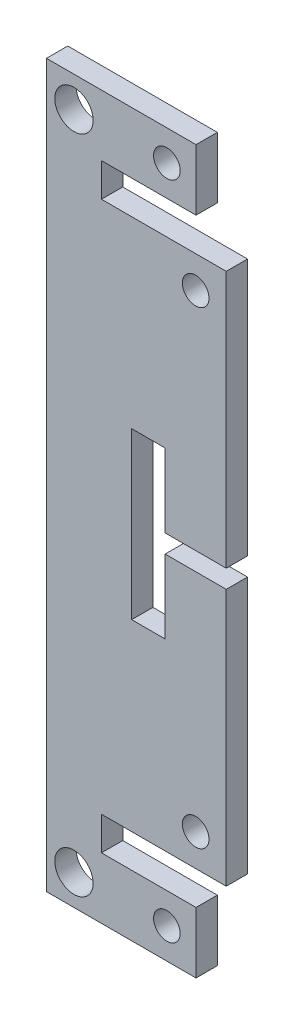
ISO-10303-21;
HEADER;
FILE_DESCRIPTION(('STEP AP214'),'2;1');
FILE_NAME('part.step','',(''),(''),'','','');
FILE_SCHEMA(('AUTOMOTIVE_DESIGN { 1 0 10303 214 1 1 1 1 }'));
ENDSEC;
DATA;
#1=APPLICATION_CONTEXT('core data for automotive mechanical design processes');
#2=APPLICATION_PROTOCOL_DEFINITION('international standard','automotive_design',2000,#1);
#3=PRODUCT_CONTEXT('',#1,'mechanical');
#4=PRODUCT('Part','Part','',(#3));
#5=PRODUCT_RELATED_PRODUCT_CATEGORY('part','',(#4));
#6=PRODUCT_DEFINITION_FORMATION('','',#4);
#7=PRODUCT_DEFINITION_CONTEXT('part definition',#1,'design');
#8=PRODUCT_DEFINITION('design','',#6,#7);
#9=PRODUCT_DEFINITION_SHAPE('','',#8);
#10=(LENGTH_UNIT() NAMED_UNIT(*) SI_UNIT(.MILLI.,.METRE.));
#11=(NAMED_UNIT(*) PLANE_ANGLE_UNIT() SI_UNIT($,.RADIAN.));
#12=(NAMED_UNIT(*) SI_UNIT($,.STERADIAN.) SOLID_ANGLE_UNIT());
#13=UNCERTAINTY_MEASURE_WITH_UNIT(LENGTH_MEASURE(1.E-05),#10,'distance_accuracy_value','');
#14=(GEOMETRIC_REPRESENTATION_CONTEXT(3) GLOBAL_UNCERTAINTY_ASSIGNED_CONTEXT((#13)) GLOBAL_UNIT_ASSIGNED_CONTEXT((#10,
#11,#12)) REPRESENTATION_CONTEXT('',''));
#15=CARTESIAN_POINT('',(0.,0.,0.));
#16=DIRECTION('',(0.,0.,1.));
#17=DIRECTION('',(1.,0.,0.));
#18=AXIS2_PLACEMENT_3D('',#15,#16,#17);
#19=CARTESIAN_POINT('',(0.,0.,-2.));
#20=DIRECTION('',(-1.,0.,0.));
#21=DIRECTION('',(0.,0.,1.));
#22=AXIS2_PLACEMENT_3D('',#19,#20,#21);
#23=PLANE('',#22);
#24=DIRECTION('',(0.,-1.,0.));
#25=VECTOR('',#24,1.);
#26=CARTESIAN_POINT('',(0.,0.,0.));
#27=LINE('',#26,#25);
#28=CARTESIAN_POINT('',(0.,33.8781926535898,0.));
#29=VERTEX_POINT('',#28);
#30=CARTESIAN_POINT('',(0.,-33.8781926535898,0.));
#31=VERTEX_POINT('',#30);
#32=EDGE_CURVE('E530',#29,#31,#27,.T.);
#33=ORIENTED_EDGE('',*,*,#32,.F.);
#34=DIRECTION('',(0.,0.,-1.));
#35=VECTOR('',#34,1.);
#36=CARTESIAN_POINT('',(0.,33.8781926535898,0.));
#37=LINE('',#36,#35);
#38=CARTESIAN_POINT('',(0.,33.8781926535898,-1.99999999999996));
#39=VERTEX_POINT('',#38);
#40=EDGE_CURVE('E361',#29,#39,#37,.T.);
#41=ORIENTED_EDGE('',*,*,#40,.T.);
#42=DIRECTION('',(0.,-1.,0.));
#43=VECTOR('',#42,1.);
#44=CARTESIAN_POINT('',(0.,0.,-2.));
#45=LINE('',#44,#43);
#46=CARTESIAN_POINT('',(0.,-33.8781926535898,-1.99999999999996));
#47=VERTEX_POINT('',#46);
#48=EDGE_CURVE('E301',#39,#47,#45,.T.);
#49=ORIENTED_EDGE('',*,*,#48,.T.);
#50=DIRECTION('',(0.,0.,-1.));
#51=VECTOR('',#50,1.);
#52=CARTESIAN_POINT('',(0.,-33.8781926535898,0.));
#53=LINE('',#52,#51);
#54=EDGE_CURVE('E422',#31,#47,#53,.T.);
#55=ORIENTED_EDGE('',*,*,#54,.F.);
#56=EDGE_LOOP('',(#33,#41,#49,#55));
#57=FACE_BOUND('',#56,.T.);
#58=ADVANCED_FACE('F152',(#57),#23,.T.);
#59=CARTESIAN_POINT('',(0.,0.,-2.));
#60=DIRECTION('',(0.,0.,-1.));
#61=DIRECTION('',(-1.,0.,0.));
#62=AXIS2_PLACEMENT_3D('',#59,#60,#61);
#63=PLANE('',#62);
#64=ORIENTED_EDGE('',*,*,#48,.F.);
#65=DIRECTION('',(1.,0.,0.));
#66=VECTOR('',#65,1.);
#67=CARTESIAN_POINT('',(7.30499265358981,33.8781926535898,-1.99999999999997));
#68=LINE('',#67,#66);
#69=CARTESIAN_POINT('',(14.0415926535898,33.8781926535898,-1.99999999999992));
#70=VERTEX_POINT('',#69);
#71=EDGE_CURVE('E401',#70,#39,#68,.F.);
#72=ORIENTED_EDGE('',*,*,#71,.F.);
#73=DIRECTION('',(0.,-1.,0.));
#74=VECTOR('',#73,1.);
#75=CARTESIAN_POINT('',(14.0415926535898,33.8781926535898,-1.99999999999992));
#76=LINE('',#75,#74);
#77=CARTESIAN_POINT('',(14.0415926535898,28.1415926535898,-1.99999999999996));
#78=VERTEX_POINT('',#77);
#79=EDGE_CURVE('E398',#78,#70,#76,.F.);
#80=ORIENTED_EDGE('',*,*,#79,.F.);
#81=DIRECTION('',(-1.,0.,0.));
#82=VECTOR('',#81,1.);
#83=CARTESIAN_POINT('',(14.0415926535898,28.1415926535898,-1.99999999999996));
#84=LINE('',#83,#82);
#85=CARTESIAN_POINT('',(5.1634,28.1415926535898,-2.));
#86=VERTEX_POINT('',#85);
#87=EDGE_CURVE('E373',#86,#78,#84,.F.);
#88=ORIENTED_EDGE('',*,*,#87,.F.);
#89=DIRECTION('',(0.,1.,0.));
#90=VECTOR('',#89,1.);
#91=CARTESIAN_POINT('',(5.1634,26.5707963267949,-2.));
#92=LINE('',#91,#90);
#93=CARTESIAN_POINT('',(5.1634,25.,-2.));
#94=VERTEX_POINT('',#93);
#95=EDGE_CURVE('E410',#86,#94,#92,.F.);
#96=ORIENTED_EDGE('',*,*,#95,.T.);
#97=DIRECTION('',(-1.,0.,0.));
#98=VECTOR('',#97,1.);
#99=CARTESIAN_POINT('',(0.,25.,-2.));
#100=LINE('',#99,#98);
#101=CARTESIAN_POINT('',(16.8781926535898,25.,-1.99999999999996));
#102=VERTEX_POINT('',#101);
#103=EDGE_CURVE('E539',#102,#94,#100,.T.);
#104=ORIENTED_EDGE('',*,*,#103,.F.);
#105=DIRECTION('',(0.,-1.,0.));
#106=VECTOR('',#105,1.);
#107=CARTESIAN_POINT('',(16.8781926535898,5.6217073464102,-1.99999999999997));
#108=LINE('',#107,#106);
#109=CARTESIAN_POINT('',(16.8781926535898,0.858407346410201,-1.99999999999994));
#110=VERTEX_POINT('',#109);
#111=EDGE_CURVE('E316',#110,#102,#108,.F.);
#112=ORIENTED_EDGE('',*,*,#111,.F.);
#113=DIRECTION('',(-1.,0.,0.));
#114=VECTOR('',#113,1.);
#115=CARTESIAN_POINT('',(16.8781926535898,0.858407346410201,-1.99999999999994));
#116=LINE('',#115,#114);
#117=CARTESIAN_POINT('',(11.1415926535898,0.858407346410201,-1.99999999999998));
#118=VERTEX_POINT('',#117);
#119=EDGE_CURVE('E349',#118,#110,#116,.F.);
#120=ORIENTED_EDGE('',*,*,#119,.F.);
#121=DIRECTION('',(0.,1.,0.));
#122=VECTOR('',#121,1.);
#123=CARTESIAN_POINT('',(11.1415926535898,0.858407346410201,-1.99999999999998));
#124=LINE('',#123,#122);
#125=CARTESIAN_POINT('',(11.1415926535898,7.7633,-2.));
#126=VERTEX_POINT('',#125);
#127=EDGE_CURVE('E312',#126,#118,#124,.F.);
#128=ORIENTED_EDGE('',*,*,#127,.F.);
#129=DIRECTION('',(-1.,0.,0.));
#130=VECTOR('',#129,1.);
#131=CARTESIAN_POINT('',(9.5707963267949,7.7633,-2.));
#132=LINE('',#131,#130);
#133=CARTESIAN_POINT('',(8.,7.7633,-2.));
#134=VERTEX_POINT('',#133);
#135=EDGE_CURVE('E325',#126,#134,#132,.T.);
#136=ORIENTED_EDGE('',*,*,#135,.T.);
#137=DIRECTION('',(0.,1.,0.));
#138=VECTOR('',#137,1.);
#139=CARTESIAN_POINT('',(8.,0.,-2.));
#140=LINE('',#139,#138);
#141=CARTESIAN_POINT('',(8.,-7.7633,-2.));
#142=VERTEX_POINT('',#141);
#143=EDGE_CURVE('E529',#142,#134,#140,.T.);
#144=ORIENTED_EDGE('',*,*,#143,.F.);
#145=DIRECTION('',(-1.,0.,0.));
#146=VECTOR('',#145,1.);
#147=CARTESIAN_POINT('',(9.5707963267949,-7.7633,-2.));
#148=LINE('',#147,#146);
#149=CARTESIAN_POINT('',(11.1415926535898,-7.7633,-2.));
#150=VERTEX_POINT('',#149);
#151=EDGE_CURVE('E521',#142,#150,#148,.F.);
#152=ORIENTED_EDGE('',*,*,#151,.T.);
#153=DIRECTION('',(0.,1.,0.));
#154=VECTOR('',#153,1.);
#155=CARTESIAN_POINT('',(11.1415926535898,-6.1925036732051,-2.));
#156=LINE('',#155,#154);
#157=CARTESIAN_POINT('',(11.1415926535898,-0.858407346410197,-1.99999999999997));
#158=VERTEX_POINT('',#157);
#159=EDGE_CURVE('E495',#150,#158,#156,.T.);
#160=ORIENTED_EDGE('',*,*,#159,.T.);
#161=DIRECTION('',(-1.,0.,0.));
#162=VECTOR('',#161,1.);
#163=CARTESIAN_POINT('',(16.8781926535898,-0.858407346410197,-1.99999999999993));
#164=LINE('',#163,#162);
#165=CARTESIAN_POINT('',(16.8781926535898,-0.858407346410197,-1.99999999999993));
#166=VERTEX_POINT('',#165);
#167=EDGE_CURVE('E484',#158,#166,#164,.F.);
#168=ORIENTED_EDGE('',*,*,#167,.T.);
#169=DIRECTION('',(0.,1.,0.));
#170=VECTOR('',#169,1.);
#171=CARTESIAN_POINT('',(16.8781926535898,-25.,-1.99999999999996));
#172=LINE('',#171,#170);
#173=CARTESIAN_POINT('',(16.8781926535898,-25.,-1.99999999999996));
#174=VERTEX_POINT('',#173);
#175=EDGE_CURVE('E501',#166,#174,#172,.F.);
#176=ORIENTED_EDGE('',*,*,#175,.T.);
#177=DIRECTION('',(-1.,0.,0.));
#178=VECTOR('',#177,1.);
#179=CARTESIAN_POINT('',(0.,-25.,-2.));
#180=LINE('',#179,#178);
#181=CARTESIAN_POINT('',(5.1634,-25.,-2.));
#182=VERTEX_POINT('',#181);
#183=EDGE_CURVE('E533',#174,#182,#180,.T.);
#184=ORIENTED_EDGE('',*,*,#183,.T.);
#185=DIRECTION('',(0.,1.,0.));
#186=VECTOR('',#185,1.);
#187=CARTESIAN_POINT('',(5.1634,-26.5707963267949,-2.));
#188=LINE('',#187,#186);
#189=CARTESIAN_POINT('',(5.1634,-28.1415926535898,-2.));
#190=VERTEX_POINT('',#189);
#191=EDGE_CURVE('E471',#182,#190,#188,.F.);
#192=ORIENTED_EDGE('',*,*,#191,.T.);
#193=DIRECTION('',(-1.,0.,0.));
#194=VECTOR('',#193,1.);
#195=CARTESIAN_POINT('',(14.0415926535898,-28.1415926535898,-1.99999999999996));
#196=LINE('',#195,#194);
#197=CARTESIAN_POINT('',(14.0415926535898,-28.1415926535898,-1.99999999999996));
#198=VERTEX_POINT('',#197);
#199=EDGE_CURVE('E449',#190,#198,#196,.F.);
#200=ORIENTED_EDGE('',*,*,#199,.T.);
#201=DIRECTION('',(0.,1.,0.));
#202=VECTOR('',#201,1.);
#203=CARTESIAN_POINT('',(14.0415926535898,-33.8781926535898,-1.99999999999992));
#204=LINE('',#203,#202);
#205=CARTESIAN_POINT('',(14.0415926535898,-33.8781926535898,-1.99999999999992));
#206=VERTEX_POINT('',#205);
#207=EDGE_CURVE('E446',#198,#206,#204,.F.);
#208=ORIENTED_EDGE('',*,*,#207,.T.);
#209=DIRECTION('',(1.,0.,0.));
#210=VECTOR('',#209,1.);
#211=CARTESIAN_POINT('',(7.30499265358981,-33.8781926535898,-1.99999999999997));
#212=LINE('',#211,#210);
#213=EDGE_CURVE('E442',#206,#47,#212,.F.);
#214=ORIENTED_EDGE('',*,*,#213,.T.);
#215=EDGE_LOOP('',(#64,#72,#80,#88,#96,#104,#112,#120,#128,#136,#144,#152,#160,#168,#176,#184,
#192,#200,#208,#214));
#216=FACE_BOUND('',#215,.T.);
#217=CARTESIAN_POINT('',(14.0098926535898,-22.,-1.99999999999998));
#218=DIRECTION('',(0.,0.,1.));
#219=DIRECTION('',(-1.,0.,0.));
#220=AXIS2_PLACEMENT_3D('',#217,#218,#219);
#221=CIRCLE('',#220,1.25);
#222=CARTESIAN_POINT('',(12.7598926535898,-22.,-1.99999999999999));
#223=VERTEX_POINT('',#222);
#224=EDGE_CURVE('E506',#223,#223,#221,.T.);
#225=ORIENTED_EDGE('',*,*,#224,.T.);
#226=EDGE_LOOP('',(#225));
#227=FACE_BOUND('',#226,.T.);
#228=CARTESIAN_POINT('',(2.5817,-31.0098926535898,-1.99999999999998));
#229=DIRECTION('',(0.,0.,1.));
#230=DIRECTION('',(0.,-1.,0.));
#231=AXIS2_PLACEMENT_3D('',#228,#229,#230);
#232=CIRCLE('',#231,1.8);
#233=CARTESIAN_POINT('',(2.5817,-32.8098926535898,-1.99999999999997));
#234=VERTEX_POINT('',#233);
#235=EDGE_CURVE('E430',#234,#234,#232,.F.);
#236=ORIENTED_EDGE('',*,*,#235,.F.);
#237=EDGE_LOOP('',(#236));
#238=FACE_BOUND('',#237,.T.);
#239=CARTESIAN_POINT('',(11.3049926535898,-31.0098926535898,-1.99999999999996));
#240=DIRECTION('',(0.,0.,1.));
#241=DIRECTION('',(1.,0.,0.));
#242=AXIS2_PLACEMENT_3D('',#239,#240,#241);
#243=CIRCLE('',#242,1.25);
#244=CARTESIAN_POINT('',(12.5549926535898,-31.0098926535898,-1.99999999999995));
#245=VERTEX_POINT('',#244);
#246=EDGE_CURVE('E414',#245,#245,#243,.F.);
#247=ORIENTED_EDGE('',*,*,#246,.F.);
#248=EDGE_LOOP('',(#247));
#249=FACE_BOUND('',#248,.T.);
#250=CARTESIAN_POINT('',(11.3049926535898,31.0098926535898,-1.99999999999996));
#251=DIRECTION('',(0.,0.,-1.));
#252=DIRECTION('',(1.,0.,0.));
#253=AXIS2_PLACEMENT_3D('',#250,#251,#252);
#254=CIRCLE('',#253,1.25);
#255=CARTESIAN_POINT('',(12.5549926535898,31.0098926535898,-1.99999999999995));
#256=VERTEX_POINT('',#255);
#257=EDGE_CURVE('E376',#256,#256,#254,.F.);
#258=ORIENTED_EDGE('',*,*,#257,.T.);
#259=EDGE_LOOP('',(#258));
#260=FACE_BOUND('',#259,.T.);
#261=CARTESIAN_POINT('',(2.5817,31.0098926535898,-1.99999999999998));
#262=DIRECTION('',(0.,0.,-1.));
#263=DIRECTION('',(0.,1.,0.));
#264=AXIS2_PLACEMENT_3D('',#261,#262,#263);
#265=CIRCLE('',#264,1.8);
#266=CARTESIAN_POINT('',(2.5817,32.8098926535898,-1.99999999999997));
#267=VERTEX_POINT('',#266);
#268=EDGE_CURVE('E365',#267,#267,#265,.F.);
#269=ORIENTED_EDGE('',*,*,#268,.T.);
#270=EDGE_LOOP('',(#269));
#271=FACE_BOUND('',#270,.T.);
#272=CARTESIAN_POINT('',(14.0098926535898,22.,-1.99999999999998));
#273=DIRECTION('',(0.,0.,-1.));
#274=DIRECTION('',(-1.,0.,0.));
#275=AXIS2_PLACEMENT_3D('',#272,#273,#274);
#276=CIRCLE('',#275,1.25);
#277=CARTESIAN_POINT('',(12.7598926535898,22.,-1.99999999999999));
#278=VERTEX_POINT('',#277);
#279=EDGE_CURVE('E328',#278,#278,#276,.T.);
#280=ORIENTED_EDGE('',*,*,#279,.F.);
#281=EDGE_LOOP('',(#280));
#282=FACE_BOUND('',#281,.T.);
#283=ADVANCED_FACE('F565',(#216,#227,#238,#249,#260,#271,#282),#63,.T.);
#284=CARTESIAN_POINT('',(0.,0.,0.));
#285=DIRECTION('',(0.,0.,-1.));
#286=DIRECTION('',(-1.,0.,0.));
#287=AXIS2_PLACEMENT_3D('',#284,#285,#286);
#288=PLANE('',#287);
#289=ORIENTED_EDGE('',*,*,#32,.T.);
#290=DIRECTION('',(-1.,0.,0.));
#291=VECTOR('',#290,1.);
#292=CARTESIAN_POINT('',(33.3049926535898,-33.8781926535898,2.15105711021124E-13));
#293=LINE('',#292,#291);
#294=CARTESIAN_POINT('',(14.0415926535898,-33.8781926535898,0.));
#295=VERTEX_POINT('',#294);
#296=EDGE_CURVE('E460',#295,#31,#293,.T.);
#297=ORIENTED_EDGE('',*,*,#296,.F.);
#298=DIRECTION('',(0.,-1.,0.));
#299=VECTOR('',#298,1.);
#300=CARTESIAN_POINT('',(14.0415926535898,-25.1415926535897,0.));
#301=LINE('',#300,#299);
#302=CARTESIAN_POINT('',(14.0415926535898,-28.1415926535898,0.));
#303=VERTEX_POINT('',#302);
#304=EDGE_CURVE('E457',#303,#295,#301,.T.);
#305=ORIENTED_EDGE('',*,*,#304,.F.);
#306=DIRECTION('',(1.,0.,0.));
#307=VECTOR('',#306,1.);
#308=CARTESIAN_POINT('',(33.3049926535898,-28.1415926535898,1.73472347597681E-13));
#309=LINE('',#308,#307);
#310=CARTESIAN_POINT('',(5.1634,-28.1415926535898,0.));
#311=VERTEX_POINT('',#310);
#312=EDGE_CURVE('E438',#311,#303,#309,.T.);
#313=ORIENTED_EDGE('',*,*,#312,.F.);
#314=DIRECTION('',(0.,1.,0.));
#315=VECTOR('',#314,1.);
#316=CARTESIAN_POINT('',(5.1634,-26.5707963267949,0.));
#317=LINE('',#316,#315);
#318=CARTESIAN_POINT('',(5.1634,-25.,0.));
#319=VERTEX_POINT('',#318);
#320=EDGE_CURVE('E421',#319,#311,#317,.F.);
#321=ORIENTED_EDGE('',*,*,#320,.F.);
#322=DIRECTION('',(-1.,0.,0.));
#323=VECTOR('',#322,1.);
#324=CARTESIAN_POINT('',(0.,-25.,0.));
#325=LINE('',#324,#323);
#326=CARTESIAN_POINT('',(16.8781926535898,-25.,0.));
#327=VERTEX_POINT('',#326);
#328=EDGE_CURVE('E524',#327,#319,#325,.T.);
#329=ORIENTED_EDGE('',*,*,#328,.F.);
#330=DIRECTION('',(0.,-1.,0.));
#331=VECTOR('',#330,1.);
#332=CARTESIAN_POINT('',(16.8781926535898,0.,0.));
#333=LINE('',#332,#331);
#334=CARTESIAN_POINT('',(16.8781926535898,-0.858407346410211,0.));
#335=VERTEX_POINT('',#334);
#336=EDGE_CURVE('E498',#335,#327,#333,.T.);
#337=ORIENTED_EDGE('',*,*,#336,.F.);
#338=DIRECTION('',(1.,0.,0.));
#339=VECTOR('',#338,1.);
#340=CARTESIAN_POINT('',(8.14159265358975,-0.85840734641021,0.));
#341=LINE('',#340,#339);
#342=CARTESIAN_POINT('',(11.1415926535898,-0.85840734641021,0.));
#343=VERTEX_POINT('',#342);
#344=EDGE_CURVE('E475',#343,#335,#341,.T.);
#345=ORIENTED_EDGE('',*,*,#344,.F.);
#346=DIRECTION('',(0.,1.,0.));
#347=VECTOR('',#346,1.);
#348=CARTESIAN_POINT('',(11.1415926535898,-6.1925036732051,0.));
#349=LINE('',#348,#347);
#350=CARTESIAN_POINT('',(11.1415926535898,-7.7633,0.));
#351=VERTEX_POINT('',#350);
#352=EDGE_CURVE('E483',#351,#343,#349,.T.);
#353=ORIENTED_EDGE('',*,*,#352,.F.);
#354=DIRECTION('',(-1.,0.,0.));
#355=VECTOR('',#354,1.);
#356=CARTESIAN_POINT('',(9.5707963267949,-7.7633,0.));
#357=LINE('',#356,#355);
#358=CARTESIAN_POINT('',(8.,-7.7633,0.));
#359=VERTEX_POINT('',#358);
#360=EDGE_CURVE('E505',#359,#351,#357,.F.);
#361=ORIENTED_EDGE('',*,*,#360,.F.);
#362=DIRECTION('',(0.,1.,0.));
#363=VECTOR('',#362,1.);
#364=CARTESIAN_POINT('',(8.,0.,0.));
#365=LINE('',#364,#363);
#366=CARTESIAN_POINT('',(7.99999999999999,7.7633,0.));
#367=VERTEX_POINT('',#366);
#368=EDGE_CURVE('E156',#359,#367,#365,.T.);
#369=ORIENTED_EDGE('',*,*,#368,.T.);
#370=DIRECTION('',(-1.,0.,0.));
#371=VECTOR('',#370,1.);
#372=CARTESIAN_POINT('',(9.5707963267949,7.7633,0.));
#373=LINE('',#372,#371);
#374=CARTESIAN_POINT('',(11.1415926535898,7.7633,0.));
#375=VERTEX_POINT('',#374);
#376=EDGE_CURVE('E319',#375,#367,#373,.T.);
#377=ORIENTED_EDGE('',*,*,#376,.F.);
#378=DIRECTION('',(0.,-1.,0.));
#379=VECTOR('',#378,1.);
#380=CARTESIAN_POINT('',(11.1415926535898,-3.37829265358981,0.));
#381=LINE('',#380,#379);
#382=CARTESIAN_POINT('',(11.1415926535898,0.858407346410214,0.));
#383=VERTEX_POINT('',#382);
#384=EDGE_CURVE('E342',#375,#383,#381,.T.);
#385=ORIENTED_EDGE('',*,*,#384,.T.);
#386=DIRECTION('',(1.,0.,0.));
#387=VECTOR('',#386,1.);
#388=CARTESIAN_POINT('',(8.14159265358975,0.858407346410214,0.));
#389=LINE('',#388,#387);
#390=CARTESIAN_POINT('',(16.8781926535898,0.858407346410215,0.));
#391=VERTEX_POINT('',#390);
#392=EDGE_CURVE('E307',#383,#391,#389,.T.);
#393=ORIENTED_EDGE('',*,*,#392,.T.);
#394=DIRECTION('',(0.,1.,0.));
#395=VECTOR('',#394,1.);
#396=CARTESIAN_POINT('',(16.8781926535898,-3.37829265358981,0.));
#397=LINE('',#396,#395);
#398=CARTESIAN_POINT('',(16.8781926535898,25.,0.));
#399=VERTEX_POINT('',#398);
#400=EDGE_CURVE('E304',#391,#399,#397,.T.);
#401=ORIENTED_EDGE('',*,*,#400,.T.);
#402=DIRECTION('',(-1.,0.,0.));
#403=VECTOR('',#402,1.);
#404=CARTESIAN_POINT('',(0.,25.,0.));
#405=LINE('',#404,#403);
#406=CARTESIAN_POINT('',(5.1634,25.,0.));
#407=VERTEX_POINT('',#406);
#408=EDGE_CURVE('E294',#399,#407,#405,.T.);
#409=ORIENTED_EDGE('',*,*,#408,.T.);
#410=DIRECTION('',(0.,1.,0.));
#411=VECTOR('',#410,1.);
#412=CARTESIAN_POINT('',(5.1634,26.5707963267949,0.));
#413=LINE('',#412,#411);
#414=CARTESIAN_POINT('',(5.1634,28.1415926535898,0.));
#415=VERTEX_POINT('',#414);
#416=EDGE_CURVE('E177',#415,#407,#413,.F.);
#417=ORIENTED_EDGE('',*,*,#416,.F.);
#418=DIRECTION('',(1.,0.,0.));
#419=VECTOR('',#418,1.);
#420=CARTESIAN_POINT('',(33.3049926535898,28.1415926535898,1.73472347597681E-13));
#421=LINE('',#420,#419);
#422=CARTESIAN_POINT('',(14.0415926535898,28.1415926535898,0.));
#423=VERTEX_POINT('',#422);
#424=EDGE_CURVE('E387',#415,#423,#421,.T.);
#425=ORIENTED_EDGE('',*,*,#424,.T.);
#426=DIRECTION('',(0.,1.,0.));
#427=VECTOR('',#426,1.);
#428=CARTESIAN_POINT('',(14.0415926535898,25.1415926535897,0.));
#429=LINE('',#428,#427);
#430=CARTESIAN_POINT('',(14.0415926535898,33.8781926535898,0.));
#431=VERTEX_POINT('',#430);
#432=EDGE_CURVE('E384',#423,#431,#429,.T.);
#433=ORIENTED_EDGE('',*,*,#432,.T.);
#434=DIRECTION('',(-1.,0.,0.));
#435=VECTOR('',#434,1.);
#436=CARTESIAN_POINT('',(33.3049926535898,33.8781926535898,2.15105711021124E-13));
#437=LINE('',#436,#435);
#438=EDGE_CURVE('E380',#431,#29,#437,.T.);
#439=ORIENTED_EDGE('',*,*,#438,.T.);
#440=EDGE_LOOP('',(#289,#297,#305,#313,#321,#329,#337,#345,#353,#361,#369,#377,#385,#393,#401,
#409,#417,#425,#433,#439));
#441=FACE_BOUND('',#440,.T.);
#442=CARTESIAN_POINT('',(14.0098926535898,-22.,0.));
#443=DIRECTION('',(0.,0.,-1.));
#444=DIRECTION('',(1.,0.,0.));
#445=AXIS2_PLACEMENT_3D('',#442,#443,#444);
#446=CIRCLE('',#445,1.25);
#447=CARTESIAN_POINT('',(15.2598926535898,-22.,0.));
#448=VERTEX_POINT('',#447);
#449=EDGE_CURVE('E510',#448,#448,#446,.T.);
#450=ORIENTED_EDGE('',*,*,#449,.T.);
#451=EDGE_LOOP('',(#450));
#452=FACE_BOUND('',#451,.T.);
#453=CARTESIAN_POINT('',(2.5817,-31.0098926535898,0.));
#454=DIRECTION('',(0.,0.,-1.));
#455=DIRECTION('',(0.,1.,0.));
#456=AXIS2_PLACEMENT_3D('',#453,#454,#455);
#457=CIRCLE('',#456,1.8);
#458=CARTESIAN_POINT('',(2.5817,-29.2098926535898,0.));
#459=VERTEX_POINT('',#458);
#460=EDGE_CURVE('E417',#459,#459,#457,.T.);
#461=ORIENTED_EDGE('',*,*,#460,.T.);
#462=EDGE_LOOP('',(#461));
#463=FACE_BOUND('',#462,.T.);
#464=CARTESIAN_POINT('',(11.3049926535898,-31.0098926535898,0.));
#465=DIRECTION('',(0.,0.,1.));
#466=DIRECTION('',(1.,0.,0.));
#467=AXIS2_PLACEMENT_3D('',#464,#465,#466);
#468=CIRCLE('',#467,1.25);
#469=CARTESIAN_POINT('',(12.5549926535898,-31.0098926535898,0.));
#470=VERTEX_POINT('',#469);
#471=EDGE_CURVE('E464',#470,#470,#468,.T.);
#472=ORIENTED_EDGE('',*,*,#471,.F.);
#473=EDGE_LOOP('',(#472));
#474=FACE_BOUND('',#473,.T.);
#475=CARTESIAN_POINT('',(11.3049926535898,31.0098926535898,0.));
#476=DIRECTION('',(0.,0.,-1.));
#477=DIRECTION('',(1.,0.,0.));
#478=AXIS2_PLACEMENT_3D('',#475,#476,#477);
#479=CIRCLE('',#478,1.25);
#480=CARTESIAN_POINT('',(12.5549926535898,31.0098926535898,0.));
#481=VERTEX_POINT('',#480);
#482=EDGE_CURVE('E390',#481,#481,#479,.T.);
#483=ORIENTED_EDGE('',*,*,#482,.T.);
#484=EDGE_LOOP('',(#483));
#485=FACE_BOUND('',#484,.T.);
#486=CARTESIAN_POINT('',(2.5817,31.0098926535898,0.));
#487=DIRECTION('',(0.,0.,1.));
#488=DIRECTION('',(0.,-1.,0.));
#489=AXIS2_PLACEMENT_3D('',#486,#487,#488);
#490=CIRCLE('',#489,1.8);
#491=CARTESIAN_POINT('',(2.5817,29.2098926535898,0.));
#492=VERTEX_POINT('',#491);
#493=EDGE_CURVE('E369',#492,#492,#490,.T.);
#494=ORIENTED_EDGE('',*,*,#493,.F.);
#495=EDGE_LOOP('',(#494));
#496=FACE_BOUND('',#495,.T.);
#497=CARTESIAN_POINT('',(14.0098926535898,22.,0.));
#498=DIRECTION('',(0.,0.,1.));
#499=DIRECTION('',(1.,0.,0.));
#500=AXIS2_PLACEMENT_3D('',#497,#498,#499);
#501=CIRCLE('',#500,1.25);
#502=CARTESIAN_POINT('',(15.2598926535898,22.,0.));
#503=VERTEX_POINT('',#502);
#504=EDGE_CURVE('E320',#503,#503,#501,.T.);
#505=ORIENTED_EDGE('',*,*,#504,.F.);
#506=EDGE_LOOP('',(#505));
#507=FACE_BOUND('',#506,.T.);
#508=ADVANCED_FACE('F154',(#441,#452,#463,#474,#485,#496,#507),#288,.F.);
#509=CARTESIAN_POINT('',(6.5817,25.,-2.));
#510=DIRECTION('',(0.,1.,0.));
#511=DIRECTION('',(-1.,0.,0.));
#512=AXIS2_PLACEMENT_3D('',#509,#510,#511);
#513=PLANE('',#512);
#514=ORIENTED_EDGE('',*,*,#408,.F.);
#515=DIRECTION('',(0.,0.,-1.));
#516=VECTOR('',#515,1.);
#517=CARTESIAN_POINT('',(16.8781926535898,25.,0.));
#518=LINE('',#517,#516);
#519=EDGE_CURVE('E299',#399,#102,#518,.T.);
#520=ORIENTED_EDGE('',*,*,#519,.T.);
#521=ORIENTED_EDGE('',*,*,#103,.T.);
#522=DIRECTION('',(0.,0.,1.));
#523=VECTOR('',#522,1.);
#524=CARTESIAN_POINT('',(5.1634,25.,-2.));
#525=LINE('',#524,#523);
#526=EDGE_CURVE('E162',#94,#407,#525,.T.);
#527=ORIENTED_EDGE('',*,*,#526,.T.);
#528=EDGE_LOOP('',(#514,#520,#521,#527));
#529=FACE_BOUND('',#528,.T.);
#530=ADVANCED_FACE('F296',(#529),#513,.T.);
#531=CARTESIAN_POINT('',(7.99999999999999,0.,0.));
#532=DIRECTION('',(-1.,0.,0.));
#533=DIRECTION('',(0.,0.,1.));
#534=AXIS2_PLACEMENT_3D('',#531,#532,#533);
#535=PLANE('',#534);
#536=DIRECTION('',(0.,0.,-1.));
#537=VECTOR('',#536,1.);
#538=CARTESIAN_POINT('',(7.99999999999999,7.7633,0.));
#539=LINE('',#538,#537);
#540=EDGE_CURVE('E15',#367,#134,#539,.T.);
#541=ORIENTED_EDGE('',*,*,#540,.F.);
#542=ORIENTED_EDGE('',*,*,#368,.F.);
#543=DIRECTION('',(0.,0.,-1.));
#544=VECTOR('',#543,1.);
#545=CARTESIAN_POINT('',(7.99999999999999,-7.7633,0.));
#546=LINE('',#545,#544);
#547=EDGE_CURVE('E534',#359,#142,#546,.T.);
#548=ORIENTED_EDGE('',*,*,#547,.T.);
#549=ORIENTED_EDGE('',*,*,#143,.T.);
#550=EDGE_LOOP('',(#541,#542,#548,#549));
#551=FACE_BOUND('',#550,.T.);
#552=ADVANCED_FACE('F558',(#551),#535,.F.);
#553=CARTESIAN_POINT('',(6.5817,-25.,-2.));
#554=DIRECTION('',(0.,-1.,0.));
#555=DIRECTION('',(-1.,0.,0.));
#556=AXIS2_PLACEMENT_3D('',#553,#554,#555);
#557=PLANE('',#556);
#558=ORIENTED_EDGE('',*,*,#183,.F.);
#559=DIRECTION('',(0.,0.,-1.));
#560=VECTOR('',#559,1.);
#561=CARTESIAN_POINT('',(16.8781926535898,-25.,0.));
#562=LINE('',#561,#560);
#563=EDGE_CURVE('E514',#327,#174,#562,.T.);
#564=ORIENTED_EDGE('',*,*,#563,.F.);
#565=ORIENTED_EDGE('',*,*,#328,.T.);
#566=DIRECTION('',(0.,0.,1.));
#567=VECTOR('',#566,1.);
#568=CARTESIAN_POINT('',(5.1634,-25.,-2.));
#569=LINE('',#568,#567);
#570=EDGE_CURVE('E543',#182,#319,#569,.T.);
#571=ORIENTED_EDGE('',*,*,#570,.F.);
#572=EDGE_LOOP('',(#558,#564,#565,#571));
#573=FACE_BOUND('',#572,.T.);
#574=ADVANCED_FACE('F607',(#573),#557,.T.);
#575=CARTESIAN_POINT('',(9.5707963267949,-7.7633,-1.));
#576=DIRECTION('',(0.,-1.,0.));
#577=DIRECTION('',(-1.,0.,0.));
#578=AXIS2_PLACEMENT_3D('',#575,#576,#577);
#579=PLANE('',#578);
#580=ORIENTED_EDGE('',*,*,#547,.F.);
#581=ORIENTED_EDGE('',*,*,#360,.T.);
#582=DIRECTION('',(0.,0.,-1.));
#583=VECTOR('',#582,1.);
#584=CARTESIAN_POINT('',(11.1415926535898,-7.7633,0.));
#585=LINE('',#584,#583);
#586=EDGE_CURVE('E538',#351,#150,#585,.T.);
#587=ORIENTED_EDGE('',*,*,#586,.T.);
#588=ORIENTED_EDGE('',*,*,#151,.F.);
#589=EDGE_LOOP('',(#580,#581,#587,#588));
#590=FACE_BOUND('',#589,.T.);
#591=ADVANCED_FACE('F623',(#590),#579,.F.);
#592=CARTESIAN_POINT('',(16.8781926535898,-25.,0.));
#593=DIRECTION('',(-1.,0.,0.));
#594=DIRECTION('',(0.,0.,1.));
#595=AXIS2_PLACEMENT_3D('',#592,#593,#594);
#596=PLANE('',#595);
#597=ORIENTED_EDGE('',*,*,#336,.T.);
#598=ORIENTED_EDGE('',*,*,#563,.T.);
#599=ORIENTED_EDGE('',*,*,#175,.F.);
#600=DIRECTION('',(0.,0.,-1.));
#601=VECTOR('',#600,1.);
#602=CARTESIAN_POINT('',(16.8781926535898,-0.858407346410211,0.));
#603=LINE('',#602,#601);
#604=EDGE_CURVE('E488',#335,#166,#603,.T.);
#605=ORIENTED_EDGE('',*,*,#604,.F.);
#606=EDGE_LOOP('',(#597,#598,#599,#605));
#607=FACE_BOUND('',#606,.T.);
#608=ADVANCED_FACE('F612',(#607),#596,.F.);
#609=CARTESIAN_POINT('',(14.0098926535898,-22.,0.));
#610=DIRECTION('',(0.,0.,1.));
#611=DIRECTION('',(1.,0.,0.));
#612=AXIS2_PLACEMENT_3D('',#609,#610,#611);
#613=CYLINDRICAL_SURFACE('',#612,1.25);
#614=ORIENTED_EDGE('',*,*,#224,.F.);
#615=EDGE_LOOP('',(#614));
#616=FACE_BOUND('',#615,.T.);
#617=ORIENTED_EDGE('',*,*,#449,.F.);
#618=EDGE_LOOP('',(#617));
#619=FACE_BOUND('',#618,.T.);
#620=ADVANCED_FACE('F630',(#616,#619),#613,.F.);
#621=CARTESIAN_POINT('',(11.1415926535898,-6.1925036732051,-0.999999999999998));
#622=DIRECTION('',(-1.,0.,0.));
#623=DIRECTION('',(0.,1.,0.));
#624=AXIS2_PLACEMENT_3D('',#621,#622,#623);
#625=PLANE('',#624);
#626=ORIENTED_EDGE('',*,*,#586,.F.);
#627=ORIENTED_EDGE('',*,*,#352,.T.);
#628=DIRECTION('',(0.,0.,-1.));
#629=VECTOR('',#628,1.);
#630=CARTESIAN_POINT('',(11.1415926535898,-0.858407346410211,0.));
#631=LINE('',#630,#629);
#632=EDGE_CURVE('E479',#343,#158,#631,.T.);
#633=ORIENTED_EDGE('',*,*,#632,.T.);
#634=ORIENTED_EDGE('',*,*,#159,.F.);
#635=EDGE_LOOP('',(#626,#627,#633,#634));
#636=FACE_BOUND('',#635,.T.);
#637=ADVANCED_FACE('F620',(#636),#625,.T.);
#638=CARTESIAN_POINT('',(16.8781926535898,-0.858407346410211,0.));
#639=DIRECTION('',(0.,-1.,0.));
#640=DIRECTION('',(1.,0.,0.));
#641=AXIS2_PLACEMENT_3D('',#638,#639,#640);
#642=PLANE('',#641);
#643=ORIENTED_EDGE('',*,*,#167,.F.);
#644=ORIENTED_EDGE('',*,*,#632,.F.);
#645=ORIENTED_EDGE('',*,*,#344,.T.);
#646=ORIENTED_EDGE('',*,*,#604,.T.);
#647=EDGE_LOOP('',(#643,#644,#645,#646));
#648=FACE_BOUND('',#647,.T.);
#649=ADVANCED_FACE('F615',(#648),#642,.F.);
#650=CARTESIAN_POINT('',(5.1634,-26.5707963267949,-1.));
#651=DIRECTION('',(-1.,0.,0.));
#652=DIRECTION('',(0.,1.,0.));
#653=AXIS2_PLACEMENT_3D('',#650,#651,#652);
#654=PLANE('',#653);
#655=ORIENTED_EDGE('',*,*,#570,.T.);
#656=ORIENTED_EDGE('',*,*,#320,.T.);
#657=DIRECTION('',(0.,0.,1.));
#658=VECTOR('',#657,1.);
#659=CARTESIAN_POINT('',(5.1634,-28.1415926535898,-2.));
#660=LINE('',#659,#658);
#661=EDGE_CURVE('E426',#190,#311,#660,.T.);
#662=ORIENTED_EDGE('',*,*,#661,.F.);
#663=ORIENTED_EDGE('',*,*,#191,.F.);
#664=EDGE_LOOP('',(#655,#656,#662,#663));
#665=FACE_BOUND('',#664,.T.);
#666=ADVANCED_FACE('F604',(#665),#654,.F.);
#667=CARTESIAN_POINT('',(11.3049926535898,-31.0098926535897,2.83660000000004));
#668=DIRECTION('',(0.,0.,1.));
#669=DIRECTION('',(0.,-1.,0.));
#670=AXIS2_PLACEMENT_3D('',#667,#668,#669);
#671=CYLINDRICAL_SURFACE('',#670,1.25);
#672=ORIENTED_EDGE('',*,*,#246,.T.);
#673=EDGE_LOOP('',(#672));
#674=FACE_BOUND('',#673,.T.);
#675=ORIENTED_EDGE('',*,*,#471,.T.);
#676=EDGE_LOOP('',(#675));
#677=FACE_BOUND('',#676,.T.);
#678=ADVANCED_FACE('F703',(#674,#677),#671,.F.);
#679=CARTESIAN_POINT('',(7.30499265358979,-33.8781926535898,0.));
#680=DIRECTION('',(0.,1.,0.));
#681=DIRECTION('',(1.,0.,0.));
#682=AXIS2_PLACEMENT_3D('',#679,#680,#681);
#683=PLANE('',#682);
#684=ORIENTED_EDGE('',*,*,#296,.T.);
#685=ORIENTED_EDGE('',*,*,#54,.T.);
#686=ORIENTED_EDGE('',*,*,#213,.F.);
#687=DIRECTION('',(0.,0.,-1.));
#688=VECTOR('',#687,1.);
#689=CARTESIAN_POINT('',(14.0415926535898,-33.8781926535898,0.));
#690=LINE('',#689,#688);
#691=EDGE_CURVE('E453',#295,#206,#690,.T.);
#692=ORIENTED_EDGE('',*,*,#691,.F.);
#693=EDGE_LOOP('',(#684,#685,#686,#692));
#694=FACE_BOUND('',#693,.T.);
#695=ADVANCED_FACE('F594',(#694),#683,.F.);
#696=CARTESIAN_POINT('',(14.0415926535898,-33.8781926535898,0.));
#697=DIRECTION('',(-1.,0.,0.));
#698=DIRECTION('',(0.,1.,0.));
#699=AXIS2_PLACEMENT_3D('',#696,#697,#698);
#700=PLANE('',#699);
#701=ORIENTED_EDGE('',*,*,#207,.F.);
#702=DIRECTION('',(0.,0.,-1.));
#703=VECTOR('',#702,1.);
#704=CARTESIAN_POINT('',(14.0415926535898,-28.1415926535898,0.));
#705=LINE('',#704,#703);
#706=EDGE_CURVE('E434',#303,#198,#705,.T.);
#707=ORIENTED_EDGE('',*,*,#706,.F.);
#708=ORIENTED_EDGE('',*,*,#304,.T.);
#709=ORIENTED_EDGE('',*,*,#691,.T.);
#710=EDGE_LOOP('',(#701,#707,#708,#709));
#711=FACE_BOUND('',#710,.T.);
#712=ADVANCED_FACE('F598',(#711),#700,.F.);
#713=CARTESIAN_POINT('',(14.0415926535898,-28.1415926535898,0.));
#714=DIRECTION('',(0.,-1.,0.));
#715=DIRECTION('',(-1.,0.,0.));
#716=AXIS2_PLACEMENT_3D('',#713,#714,#715);
#717=PLANE('',#716);
#718=ORIENTED_EDGE('',*,*,#199,.F.);
#719=ORIENTED_EDGE('',*,*,#661,.T.);
#720=ORIENTED_EDGE('',*,*,#312,.T.);
#721=ORIENTED_EDGE('',*,*,#706,.T.);
#722=EDGE_LOOP('',(#718,#719,#720,#721));
#723=FACE_BOUND('',#722,.T.);
#724=ADVANCED_FACE('F602',(#723),#717,.F.);
#725=CARTESIAN_POINT('',(2.5817,-31.0098926535898,0.));
#726=DIRECTION('',(0.,0.,1.));
#727=DIRECTION('',(0.,1.,0.));
#728=AXIS2_PLACEMENT_3D('',#725,#726,#727);
#729=CYLINDRICAL_SURFACE('',#728,1.8);
#730=ORIENTED_EDGE('',*,*,#235,.T.);
#731=EDGE_LOOP('',(#730));
#732=FACE_BOUND('',#731,.T.);
#733=ORIENTED_EDGE('',*,*,#460,.F.);
#734=EDGE_LOOP('',(#733));
#735=FACE_BOUND('',#734,.T.);
#736=ADVANCED_FACE('F737',(#732,#735),#729,.F.);
#737=CARTESIAN_POINT('',(5.1634,26.5707963267949,-1.));
#738=DIRECTION('',(-1.,0.,0.));
#739=DIRECTION('',(0.,1.,0.));
#740=AXIS2_PLACEMENT_3D('',#737,#738,#739);
#741=PLANE('',#740);
#742=ORIENTED_EDGE('',*,*,#416,.T.);
#743=ORIENTED_EDGE('',*,*,#526,.F.);
#744=ORIENTED_EDGE('',*,*,#95,.F.);
#745=DIRECTION('',(0.,0.,1.));
#746=VECTOR('',#745,1.);
#747=CARTESIAN_POINT('',(5.1634,28.1415926535898,-2.));
#748=LINE('',#747,#746);
#749=EDGE_CURVE('E359',#86,#415,#748,.T.);
#750=ORIENTED_EDGE('',*,*,#749,.T.);
#751=EDGE_LOOP('',(#742,#743,#744,#750));
#752=FACE_BOUND('',#751,.T.);
#753=ADVANCED_FACE('F576',(#752),#741,.F.);
#754=CARTESIAN_POINT('',(11.3049926535898,31.0098926535897,2.83660000000004));
#755=DIRECTION('',(0.,0.,1.));
#756=DIRECTION('',(0.,1.,0.));
#757=AXIS2_PLACEMENT_3D('',#754,#755,#756);
#758=CYLINDRICAL_SURFACE('',#757,1.25);
#759=ORIENTED_EDGE('',*,*,#257,.F.);
#760=EDGE_LOOP('',(#759));
#761=FACE_BOUND('',#760,.T.);
#762=ORIENTED_EDGE('',*,*,#482,.F.);
#763=EDGE_LOOP('',(#762));
#764=FACE_BOUND('',#763,.T.);
#765=ADVANCED_FACE('F753',(#761,#764),#758,.F.);
#766=CARTESIAN_POINT('',(7.30499265358979,33.8781926535898,0.));
#767=DIRECTION('',(0.,-1.,0.));
#768=DIRECTION('',(1.,0.,0.));
#769=AXIS2_PLACEMENT_3D('',#766,#767,#768);
#770=PLANE('',#769);
#771=ORIENTED_EDGE('',*,*,#71,.T.);
#772=ORIENTED_EDGE('',*,*,#40,.F.);
#773=ORIENTED_EDGE('',*,*,#438,.F.);
#774=DIRECTION('',(0.,0.,-1.));
#775=VECTOR('',#774,1.);
#776=CARTESIAN_POINT('',(14.0415926535898,33.8781926535898,0.));
#777=LINE('',#776,#775);
#778=EDGE_CURVE('E404',#431,#70,#777,.T.);
#779=ORIENTED_EDGE('',*,*,#778,.T.);
#780=EDGE_LOOP('',(#771,#772,#773,#779));
#781=FACE_BOUND('',#780,.T.);
#782=ADVANCED_FACE('F588',(#781),#770,.F.);
#783=CARTESIAN_POINT('',(14.0415926535898,33.8781926535898,0.));
#784=DIRECTION('',(-1.,0.,0.));
#785=DIRECTION('',(0.,-1.,0.));
#786=AXIS2_PLACEMENT_3D('',#783,#784,#785);
#787=PLANE('',#786);
#788=ORIENTED_EDGE('',*,*,#79,.T.);
#789=ORIENTED_EDGE('',*,*,#778,.F.);
#790=ORIENTED_EDGE('',*,*,#432,.F.);
#791=DIRECTION('',(0.,0.,-1.));
#792=VECTOR('',#791,1.);
#793=CARTESIAN_POINT('',(14.0415926535898,28.1415926535898,0.));
#794=LINE('',#793,#792);
#795=EDGE_CURVE('E394',#423,#78,#794,.T.);
#796=ORIENTED_EDGE('',*,*,#795,.T.);
#797=EDGE_LOOP('',(#788,#789,#790,#796));
#798=FACE_BOUND('',#797,.T.);
#799=ADVANCED_FACE('F583',(#798),#787,.F.);
#800=CARTESIAN_POINT('',(14.0415926535898,28.1415926535898,0.));
#801=DIRECTION('',(0.,1.,0.));
#802=DIRECTION('',(-1.,0.,0.));
#803=AXIS2_PLACEMENT_3D('',#800,#801,#802);
#804=PLANE('',#803);
#805=ORIENTED_EDGE('',*,*,#424,.F.);
#806=ORIENTED_EDGE('',*,*,#749,.F.);
#807=ORIENTED_EDGE('',*,*,#87,.T.);
#808=ORIENTED_EDGE('',*,*,#795,.F.);
#809=EDGE_LOOP('',(#805,#806,#807,#808));
#810=FACE_BOUND('',#809,.T.);
#811=ADVANCED_FACE('F581',(#810),#804,.F.);
#812=CARTESIAN_POINT('',(2.5817,31.0098926535898,0.));
#813=DIRECTION('',(0.,0.,1.));
#814=DIRECTION('',(0.,-1.,0.));
#815=AXIS2_PLACEMENT_3D('',#812,#813,#814);
#816=CYLINDRICAL_SURFACE('',#815,1.8);
#817=ORIENTED_EDGE('',*,*,#268,.F.);
#818=EDGE_LOOP('',(#817));
#819=FACE_BOUND('',#818,.T.);
#820=ORIENTED_EDGE('',*,*,#493,.T.);
#821=EDGE_LOOP('',(#820));
#822=FACE_BOUND('',#821,.T.);
#823=ADVANCED_FACE('F786',(#819,#822),#816,.F.);
#824=CARTESIAN_POINT('',(9.5707963267949,7.7633,-1.));
#825=DIRECTION('',(0.,-1.,0.));
#826=DIRECTION('',(-1.,0.,0.));
#827=AXIS2_PLACEMENT_3D('',#824,#825,#826);
#828=PLANE('',#827);
#829=ORIENTED_EDGE('',*,*,#376,.T.);
#830=ORIENTED_EDGE('',*,*,#540,.T.);
#831=ORIENTED_EDGE('',*,*,#135,.F.);
#832=DIRECTION('',(0.,0.,-1.));
#833=VECTOR('',#832,1.);
#834=CARTESIAN_POINT('',(11.1415926535898,7.7633,0.));
#835=LINE('',#834,#833);
#836=EDGE_CURVE('E334',#375,#126,#835,.T.);
#837=ORIENTED_EDGE('',*,*,#836,.F.);
#838=EDGE_LOOP('',(#829,#830,#831,#837));
#839=FACE_BOUND('',#838,.T.);
#840=ADVANCED_FACE('F562',(#839),#828,.T.);
#841=CARTESIAN_POINT('',(16.8781926535898,5.62170734641021,0.));
#842=DIRECTION('',(-1.,0.,0.));
#843=DIRECTION('',(0.,1.,0.));
#844=AXIS2_PLACEMENT_3D('',#841,#842,#843);
#845=PLANE('',#844);
#846=ORIENTED_EDGE('',*,*,#111,.T.);
#847=ORIENTED_EDGE('',*,*,#519,.F.);
#848=ORIENTED_EDGE('',*,*,#400,.F.);
#849=DIRECTION('',(0.,0.,-1.));
#850=VECTOR('',#849,1.);
#851=CARTESIAN_POINT('',(16.8781926535898,0.858407346410215,0.));
#852=LINE('',#851,#850);
#853=EDGE_CURVE('E354',#391,#110,#852,.T.);
#854=ORIENTED_EDGE('',*,*,#853,.T.);
#855=EDGE_LOOP('',(#846,#847,#848,#854));
#856=FACE_BOUND('',#855,.T.);
#857=ADVANCED_FACE('F314',(#856),#845,.F.);
#858=CARTESIAN_POINT('',(16.8781926535898,0.858407346410215,0.));
#859=DIRECTION('',(0.,1.,0.));
#860=DIRECTION('',(1.,0.,0.));
#861=AXIS2_PLACEMENT_3D('',#858,#859,#860);
#862=PLANE('',#861);
#863=ORIENTED_EDGE('',*,*,#119,.T.);
#864=ORIENTED_EDGE('',*,*,#853,.F.);
#865=ORIENTED_EDGE('',*,*,#392,.F.);
#866=DIRECTION('',(0.,0.,-1.));
#867=VECTOR('',#866,1.);
#868=CARTESIAN_POINT('',(11.1415926535898,0.858407346410215,0.));
#869=LINE('',#868,#867);
#870=EDGE_CURVE('E345',#383,#118,#869,.T.);
#871=ORIENTED_EDGE('',*,*,#870,.T.);
#872=EDGE_LOOP('',(#863,#864,#865,#871));
#873=FACE_BOUND('',#872,.T.);
#874=ADVANCED_FACE('F572',(#873),#862,.F.);
#875=CARTESIAN_POINT('',(11.1415926535898,0.858407346410215,0.));
#876=DIRECTION('',(1.,0.,0.));
#877=DIRECTION('',(0.,-1.,0.));
#878=AXIS2_PLACEMENT_3D('',#875,#876,#877);
#879=PLANE('',#878);
#880=ORIENTED_EDGE('',*,*,#384,.F.);
#881=ORIENTED_EDGE('',*,*,#836,.T.);
#882=ORIENTED_EDGE('',*,*,#127,.T.);
#883=ORIENTED_EDGE('',*,*,#870,.F.);
#884=EDGE_LOOP('',(#880,#881,#882,#883));
#885=FACE_BOUND('',#884,.T.);
#886=ADVANCED_FACE('F570',(#885),#879,.F.);
#887=CARTESIAN_POINT('',(14.0098926535898,22.,0.));
#888=DIRECTION('',(0.,0.,1.));
#889=DIRECTION('',(1.,0.,0.));
#890=AXIS2_PLACEMENT_3D('',#887,#888,#889);
#891=CYLINDRICAL_SURFACE('',#890,1.25);
#892=ORIENTED_EDGE('',*,*,#279,.T.);
#893=EDGE_LOOP('',(#892));
#894=FACE_BOUND('',#893,.T.);
#895=ORIENTED_EDGE('',*,*,#504,.T.);
#896=EDGE_LOOP('',(#895));
#897=FACE_BOUND('',#896,.T.);
#898=ADVANCED_FACE('F824',(#894,#897),#891,.F.);
#899=CLOSED_SHELL('',(#58,#283,#508,#530,#552,#574,#591,#608,#620,#637,#649,#666,#678,#695,#712,
#724,#736,#753,#765,#782,#799,#811,#823,#840,#857,#874,#886,#898));
#900=MANIFOLD_SOLID_BREP('B2',#899);
#901=ADVANCED_BREP_SHAPE_REPRESENTATION('',(#18,#900),#14);
#902=SHAPE_DEFINITION_REPRESENTATION(#9,#901);
ENDSEC;
END-ISO-10303-21;
